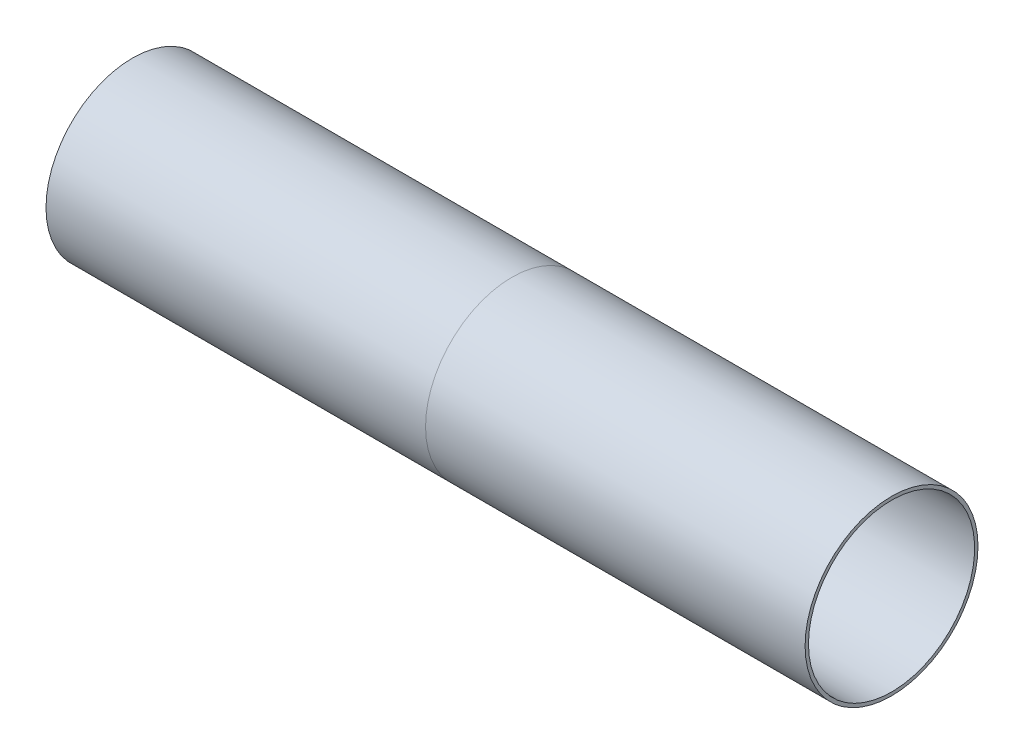
ISO-10303-21;
HEADER;
FILE_DESCRIPTION(('STEP AP214'),'2;1');
FILE_NAME('part.step','',(''),(''),'','','');
FILE_SCHEMA(('AUTOMOTIVE_DESIGN { 1 0 10303 214 1 1 1 1 }'));
ENDSEC;
DATA;
#1=APPLICATION_CONTEXT('core data for automotive mechanical design processes');
#2=APPLICATION_PROTOCOL_DEFINITION('international standard','automotive_design',2000,#1);
#3=PRODUCT_CONTEXT('',#1,'mechanical');
#4=PRODUCT('Part','Part','',(#3));
#5=PRODUCT_RELATED_PRODUCT_CATEGORY('part','',(#4));
#6=PRODUCT_DEFINITION_FORMATION('','',#4);
#7=PRODUCT_DEFINITION_CONTEXT('part definition',#1,'design');
#8=PRODUCT_DEFINITION('design','',#6,#7);
#9=PRODUCT_DEFINITION_SHAPE('','',#8);
#10=(LENGTH_UNIT() NAMED_UNIT(*) SI_UNIT(.MILLI.,.METRE.));
#11=(NAMED_UNIT(*) PLANE_ANGLE_UNIT() SI_UNIT($,.RADIAN.));
#12=(NAMED_UNIT(*) SI_UNIT($,.STERADIAN.) SOLID_ANGLE_UNIT());
#13=UNCERTAINTY_MEASURE_WITH_UNIT(LENGTH_MEASURE(1.E-05),#10,'distance_accuracy_value','');
#14=(GEOMETRIC_REPRESENTATION_CONTEXT(3) GLOBAL_UNCERTAINTY_ASSIGNED_CONTEXT((#13)) GLOBAL_UNIT_ASSIGNED_CONTEXT((#10,
#11,#12)) REPRESENTATION_CONTEXT('',''));
#15=CARTESIAN_POINT('',(0.,0.,0.));
#16=DIRECTION('',(0.,0.,1.));
#17=DIRECTION('',(1.,0.,0.));
#18=AXIS2_PLACEMENT_3D('',#15,#16,#17);
#19=CARTESIAN_POINT('',(-11.4300523027622,0.,-37.2));
#20=DIRECTION('',(1.,0.,0.));
#21=DIRECTION('',(0.,0.,-1.));
#22=AXIS2_PLACEMENT_3D('',#19,#20,#21);
#23=PLANE('',#22);
#24=CARTESIAN_POINT('',(-11.4300523027622,0.,0.));
#25=DIRECTION('',(-1.,0.,0.));
#26=DIRECTION('',(0.,0.,1.));
#27=AXIS2_PLACEMENT_3D('',#24,#25,#26);
#28=CIRCLE('',#27,37.2);
#29=CARTESIAN_POINT('',(-11.4300523027622,0.,37.2));
#30=VERTEX_POINT('',#29);
#31=EDGE_CURVE('E11',#30,#30,#28,.T.);
#32=ORIENTED_EDGE('',*,*,#31,.F.);
#33=EDGE_LOOP('',(#32));
#34=FACE_BOUND('',#33,.T.);
#35=CARTESIAN_POINT('',(-11.4300523027622,0.,0.));
#36=DIRECTION('',(-1.,0.,0.));
#37=DIRECTION('',(0.,0.,1.));
#38=AXIS2_PLACEMENT_3D('',#35,#36,#37);
#39=CIRCLE('',#38,38.4);
#40=CARTESIAN_POINT('',(-11.4300523027622,0.,38.4));
#41=VERTEX_POINT('',#40);
#42=EDGE_CURVE('E77',#41,#41,#39,.T.);
#43=ORIENTED_EDGE('',*,*,#42,.T.);
#44=EDGE_LOOP('',(#43));
#45=FACE_BOUND('',#44,.T.);
#46=ADVANCED_FACE('F58',(#34,#45),#23,.F.);
#47=CARTESIAN_POINT('',(0.,0.,0.));
#48=DIRECTION('',(-1.,0.,0.));
#49=DIRECTION('',(0.,0.,1.));
#50=AXIS2_PLACEMENT_3D('',#47,#48,#49);
#51=CYLINDRICAL_SURFACE('',#50,37.2);
#52=CARTESIAN_POINT('',(11.4300523027622,0.,0.));
#53=DIRECTION('',(-1.,0.,0.));
#54=DIRECTION('',(0.,0.,1.));
#55=AXIS2_PLACEMENT_3D('',#52,#53,#54);
#56=CIRCLE('',#55,37.2);
#57=CARTESIAN_POINT('',(11.4300523027622,0.,37.2));
#58=VERTEX_POINT('',#57);
#59=EDGE_CURVE('E64',#58,#58,#56,.T.);
#60=ORIENTED_EDGE('',*,*,#59,.F.);
#61=EDGE_LOOP('',(#60));
#62=FACE_BOUND('',#61,.T.);
#63=ORIENTED_EDGE('',*,*,#31,.T.);
#64=EDGE_LOOP('',(#63));
#65=FACE_BOUND('',#64,.T.);
#66=ADVANCED_FACE('F96',(#62,#65),#51,.F.);
#67=CARTESIAN_POINT('',(11.4300523027622,0.,-38.4));
#68=DIRECTION('',(-1.,0.,0.));
#69=DIRECTION('',(0.,0.,1.));
#70=AXIS2_PLACEMENT_3D('',#67,#68,#69);
#71=PLANE('',#70);
#72=CARTESIAN_POINT('',(11.4300523027622,0.,0.));
#73=DIRECTION('',(-1.,0.,0.));
#74=DIRECTION('',(0.,0.,1.));
#75=AXIS2_PLACEMENT_3D('',#72,#73,#74);
#76=CIRCLE('',#75,38.4);
#77=CARTESIAN_POINT('',(11.4300523027622,0.,38.4));
#78=VERTEX_POINT('',#77);
#79=EDGE_CURVE('E68',#78,#78,#76,.T.);
#80=ORIENTED_EDGE('',*,*,#79,.F.);
#81=EDGE_LOOP('',(#80));
#82=FACE_BOUND('',#81,.T.);
#83=ORIENTED_EDGE('',*,*,#59,.T.);
#84=EDGE_LOOP('',(#83));
#85=FACE_BOUND('',#84,.T.);
#86=ADVANCED_FACE('F91',(#82,#85),#71,.F.);
#87=CARTESIAN_POINT('',(11.4300523027622,0.,0.));
#88=DIRECTION('',(-1.,0.,0.));
#89=DIRECTION('',(0.,0.,1.));
#90=AXIS2_PLACEMENT_3D('',#87,#88,#89);
#91=CONICAL_SURFACE('',#90,38.4,0.0872664625997092);
#92=CARTESIAN_POINT('',(0.,0.,0.));
#93=DIRECTION('',(-1.,0.,0.));
#94=DIRECTION('',(0.,0.,1.));
#95=AXIS2_PLACEMENT_3D('',#92,#93,#94);
#96=CIRCLE('',#95,39.4);
#97=CARTESIAN_POINT('',(0.,0.,39.4));
#98=VERTEX_POINT('',#97);
#99=EDGE_CURVE('E72',#98,#98,#96,.T.);
#100=ORIENTED_EDGE('',*,*,#99,.F.);
#101=EDGE_LOOP('',(#100));
#102=FACE_BOUND('',#101,.T.);
#103=ORIENTED_EDGE('',*,*,#79,.T.);
#104=EDGE_LOOP('',(#103));
#105=FACE_BOUND('',#104,.T.);
#106=ADVANCED_FACE('F85',(#102,#105),#91,.T.);
#107=CARTESIAN_POINT('',(0.,0.,0.));
#108=DIRECTION('',(1.,0.,0.));
#109=DIRECTION('',(0.,0.,-1.));
#110=AXIS2_PLACEMENT_3D('',#107,#108,#109);
#111=CONICAL_SURFACE('',#110,39.4,0.0872664625997093);
#112=ORIENTED_EDGE('',*,*,#42,.F.);
#113=EDGE_LOOP('',(#112));
#114=FACE_BOUND('',#113,.T.);
#115=ORIENTED_EDGE('',*,*,#99,.T.);
#116=EDGE_LOOP('',(#115));
#117=FACE_BOUND('',#116,.T.);
#118=ADVANCED_FACE('F82',(#114,#117),#111,.T.);
#119=CLOSED_SHELL('',(#46,#66,#86,#106,#118));
#120=MANIFOLD_SOLID_BREP('B2_NOT_SHOWN',#119);
#121=CARTESIAN_POINT('',(0.,0.,0.));
#122=DIRECTION('',(-1.,0.,0.));
#123=DIRECTION('',(0.,0.,1.));
#124=AXIS2_PLACEMENT_3D('',#121,#122,#123);
#125=CYLINDRICAL_SURFACE('',#124,39.4);
#126=CARTESIAN_POINT('',(-12.4300523027622,0.,0.));
#127=DIRECTION('',(-1.,0.,0.));
#128=DIRECTION('',(0.,0.,1.));
#129=AXIS2_PLACEMENT_3D('',#126,#127,#128);
#130=CIRCLE('',#129,39.4);
#131=CARTESIAN_POINT('',(-12.4300523027622,0.,39.4));
#132=VERTEX_POINT('',#131);
#133=EDGE_CURVE('E179',#132,#132,#130,.T.);
#134=ORIENTED_EDGE('',*,*,#133,.F.);
#135=EDGE_LOOP('',(#134));
#136=FACE_BOUND('',#135,.T.);
#137=CARTESIAN_POINT('',(-167.569947697238,0.,0.));
#138=DIRECTION('',(1.,0.,0.));
#139=DIRECTION('',(0.,0.,-1.));
#140=AXIS2_PLACEMENT_3D('',#137,#138,#139);
#141=CIRCLE('',#140,39.4);
#142=CARTESIAN_POINT('',(-167.569947697238,0.,-39.4));
#143=VERTEX_POINT('',#142);
#144=EDGE_CURVE('E57',#143,#143,#141,.T.);
#145=ORIENTED_EDGE('',*,*,#144,.F.);
#146=EDGE_LOOP('',(#145));
#147=FACE_BOUND('',#146,.T.);
#148=ADVANCED_FACE('F162',(#136,#147),#125,.F.);
#149=CARTESIAN_POINT('',(0.,0.,0.));
#150=DIRECTION('',(-1.,0.,0.));
#151=DIRECTION('',(0.,0.,1.));
#152=AXIS2_PLACEMENT_3D('',#149,#150,#151);
#153=CYLINDRICAL_SURFACE('',#152,41.);
#154=CARTESIAN_POINT('',(0.,0.,0.));
#155=DIRECTION('',(-1.,0.,0.));
#156=DIRECTION('',(0.,0.,1.));
#157=AXIS2_PLACEMENT_3D('',#154,#155,#156);
#158=CIRCLE('',#157,41.);
#159=CARTESIAN_POINT('',(0.,0.,41.));
#160=VERTEX_POINT('',#159);
#161=EDGE_CURVE('E188',#160,#160,#158,.T.);
#162=ORIENTED_EDGE('',*,*,#161,.T.);
#163=EDGE_LOOP('',(#162));
#164=FACE_BOUND('',#163,.T.);
#165=CARTESIAN_POINT('',(-180.,0.,0.));
#166=DIRECTION('',(-1.,0.,0.));
#167=DIRECTION('',(0.,0.,1.));
#168=AXIS2_PLACEMENT_3D('',#165,#166,#167);
#169=CIRCLE('',#168,41.);
#170=CARTESIAN_POINT('',(-180.,0.,41.));
#171=VERTEX_POINT('',#170);
#172=EDGE_CURVE('E170',#171,#171,#169,.T.);
#173=ORIENTED_EDGE('',*,*,#172,.F.);
#174=EDGE_LOOP('',(#173));
#175=FACE_BOUND('',#174,.T.);
#176=ADVANCED_FACE('F205',(#164,#175),#153,.T.);
#177=CARTESIAN_POINT('',(-180.,0.,0.));
#178=DIRECTION('',(1.,0.,0.));
#179=DIRECTION('',(0.,0.,-1.));
#180=AXIS2_PLACEMENT_3D('',#177,#178,#179);
#181=PLANE('',#180);
#182=CARTESIAN_POINT('',(-180.,0.,0.));
#183=DIRECTION('',(-1.,0.,0.));
#184=DIRECTION('',(0.,0.,1.));
#185=AXIS2_PLACEMENT_3D('',#182,#183,#184);
#186=CIRCLE('',#185,39.4);
#187=CARTESIAN_POINT('',(-180.,0.,39.4));
#188=VERTEX_POINT('',#187);
#189=EDGE_CURVE('E174',#188,#188,#186,.T.);
#190=ORIENTED_EDGE('',*,*,#189,.F.);
#191=EDGE_LOOP('',(#190));
#192=FACE_BOUND('',#191,.T.);
#193=ORIENTED_EDGE('',*,*,#172,.T.);
#194=EDGE_LOOP('',(#193));
#195=FACE_BOUND('',#194,.T.);
#196=ADVANCED_FACE('F201',(#192,#195),#181,.F.);
#197=CARTESIAN_POINT('',(-11.4300523027622,0.,0.));
#198=DIRECTION('',(-1.,0.,0.));
#199=DIRECTION('',(0.,0.,1.));
#200=AXIS2_PLACEMENT_3D('',#197,#198,#199);
#201=CONICAL_SURFACE('',#200,38.4,0.785398163397444);
#202=ORIENTED_EDGE('',*,*,#133,.T.);
#203=EDGE_LOOP('',(#202));
#204=FACE_BOUND('',#203,.T.);
#205=CARTESIAN_POINT('',(-11.4300523027622,0.,0.));
#206=DIRECTION('',(-1.,0.,0.));
#207=DIRECTION('',(0.,0.,1.));
#208=AXIS2_PLACEMENT_3D('',#205,#206,#207);
#209=CIRCLE('',#208,38.4);
#210=CARTESIAN_POINT('',(-11.4300523027622,0.,38.4));
#211=VERTEX_POINT('',#210);
#212=EDGE_CURVE('E182',#211,#211,#209,.T.);
#213=ORIENTED_EDGE('',*,*,#212,.F.);
#214=EDGE_LOOP('',(#213));
#215=FACE_BOUND('',#214,.T.);
#216=ADVANCED_FACE('F204',(#204,#215),#201,.F.);
#217=CARTESIAN_POINT('',(0.,0.,0.));
#218=DIRECTION('',(1.,0.,0.));
#219=DIRECTION('',(0.,0.,-1.));
#220=AXIS2_PLACEMENT_3D('',#217,#218,#219);
#221=CONICAL_SURFACE('',#220,39.4,0.0872664625997093);
#222=ORIENTED_EDGE('',*,*,#212,.T.);
#223=EDGE_LOOP('',(#222));
#224=FACE_BOUND('',#223,.T.);
#225=CARTESIAN_POINT('',(0.,0.,0.));
#226=DIRECTION('',(-1.,0.,0.));
#227=DIRECTION('',(0.,0.,1.));
#228=AXIS2_PLACEMENT_3D('',#225,#226,#227);
#229=CIRCLE('',#228,39.4);
#230=CARTESIAN_POINT('',(0.,0.,39.4));
#231=VERTEX_POINT('',#230);
#232=EDGE_CURVE('E185',#231,#231,#229,.T.);
#233=ORIENTED_EDGE('',*,*,#232,.F.);
#234=EDGE_LOOP('',(#233));
#235=FACE_BOUND('',#234,.T.);
#236=ADVANCED_FACE('F221',(#224,#235),#221,.F.);
#237=CARTESIAN_POINT('',(0.,0.,0.));
#238=DIRECTION('',(1.,0.,0.));
#239=DIRECTION('',(0.,0.,-1.));
#240=AXIS2_PLACEMENT_3D('',#237,#238,#239);
#241=PLANE('',#240);
#242=ORIENTED_EDGE('',*,*,#232,.T.);
#243=EDGE_LOOP('',(#242));
#244=FACE_BOUND('',#243,.T.);
#245=ORIENTED_EDGE('',*,*,#161,.F.);
#246=EDGE_LOOP('',(#245));
#247=FACE_BOUND('',#246,.T.);
#248=ADVANCED_FACE('F217',(#244,#247),#241,.T.);
#249=CARTESIAN_POINT('',(-168.569947697238,0.,0.));
#250=DIRECTION('',(1.,0.,0.));
#251=DIRECTION('',(0.,0.,-1.));
#252=AXIS2_PLACEMENT_3D('',#249,#250,#251);
#253=CONICAL_SURFACE('',#252,38.4,0.785398163397431);
#254=ORIENTED_EDGE('',*,*,#144,.T.);
#255=EDGE_LOOP('',(#254));
#256=FACE_BOUND('',#255,.T.);
#257=CARTESIAN_POINT('',(-168.569947697238,0.,0.));
#258=DIRECTION('',(-1.,0.,0.));
#259=DIRECTION('',(0.,0.,1.));
#260=AXIS2_PLACEMENT_3D('',#257,#258,#259);
#261=CIRCLE('',#260,38.4);
#262=CARTESIAN_POINT('',(-168.569947697238,0.,38.4000000000001));
#263=VERTEX_POINT('',#262);
#264=EDGE_CURVE('E166',#263,#263,#261,.T.);
#265=ORIENTED_EDGE('',*,*,#264,.T.);
#266=EDGE_LOOP('',(#265));
#267=FACE_BOUND('',#266,.T.);
#268=ADVANCED_FACE('F164',(#256,#267),#253,.F.);
#269=CARTESIAN_POINT('',(-180.,0.,0.));
#270=DIRECTION('',(-1.,0.,0.));
#271=DIRECTION('',(0.,0.,1.));
#272=AXIS2_PLACEMENT_3D('',#269,#270,#271);
#273=CONICAL_SURFACE('',#272,39.4,0.0872664625997092);
#274=ORIENTED_EDGE('',*,*,#264,.F.);
#275=EDGE_LOOP('',(#274));
#276=FACE_BOUND('',#275,.T.);
#277=ORIENTED_EDGE('',*,*,#189,.T.);
#278=EDGE_LOOP('',(#277));
#279=FACE_BOUND('',#278,.T.);
#280=ADVANCED_FACE('F196',(#276,#279),#273,.F.);
#281=CLOSED_SHELL('',(#148,#176,#196,#216,#236,#248,#268,#280));
#282=MANIFOLD_SOLID_BREP('B6_NOT_SHOWN',#281);
#283=CARTESIAN_POINT('',(0.,0.,0.));
#284=DIRECTION('',(-1.,0.,0.));
#285=DIRECTION('',(0.,0.,1.));
#286=AXIS2_PLACEMENT_3D('',#283,#284,#285);
#287=CONICAL_SURFACE('',#286,39.4,0.0872664625997086);
#288=CARTESIAN_POINT('',(11.4300523027622,0.,0.));
#289=DIRECTION('',(-1.,0.,0.));
#290=DIRECTION('',(0.,0.,1.));
#291=AXIS2_PLACEMENT_3D('',#288,#289,#290);
#292=CIRCLE('',#291,38.4);
#293=CARTESIAN_POINT('',(11.4300523027622,0.,38.4));
#294=VERTEX_POINT('',#293);
#295=EDGE_CURVE('E161',#294,#294,#292,.T.);
#296=ORIENTED_EDGE('',*,*,#295,.F.);
#297=EDGE_LOOP('',(#296));
#298=FACE_BOUND('',#297,.T.);
#299=CARTESIAN_POINT('',(0.,0.,0.));
#300=DIRECTION('',(-1.,0.,0.));
#301=DIRECTION('',(0.,0.,1.));
#302=AXIS2_PLACEMENT_3D('',#299,#300,#301);
#303=CIRCLE('',#302,39.4);
#304=CARTESIAN_POINT('',(0.,0.,39.4));
#305=VERTEX_POINT('',#304);
#306=EDGE_CURVE('E349',#305,#305,#303,.T.);
#307=ORIENTED_EDGE('',*,*,#306,.T.);
#308=EDGE_LOOP('',(#307));
#309=FACE_BOUND('',#308,.T.);
#310=ADVANCED_FACE('F322',(#298,#309),#287,.F.);
#311=CARTESIAN_POINT('',(11.4300523027622,0.,0.));
#312=DIRECTION('',(1.,0.,0.));
#313=DIRECTION('',(0.,0.,-1.));
#314=AXIS2_PLACEMENT_3D('',#311,#312,#313);
#315=CONICAL_SURFACE('',#314,38.4,0.785398163397443);
#316=CARTESIAN_POINT('',(12.4300523027622,0.,0.));
#317=DIRECTION('',(-1.,0.,0.));
#318=DIRECTION('',(0.,0.,1.));
#319=AXIS2_PLACEMENT_3D('',#316,#317,#318);
#320=CIRCLE('',#319,39.4);
#321=CARTESIAN_POINT('',(12.4300523027622,0.,39.4));
#322=VERTEX_POINT('',#321);
#323=EDGE_CURVE('E329',#322,#322,#320,.T.);
#324=ORIENTED_EDGE('',*,*,#323,.F.);
#325=EDGE_LOOP('',(#324));
#326=FACE_BOUND('',#325,.T.);
#327=ORIENTED_EDGE('',*,*,#295,.T.);
#328=EDGE_LOOP('',(#327));
#329=FACE_BOUND('',#328,.T.);
#330=ADVANCED_FACE('F375',(#326,#329),#315,.F.);
#331=CARTESIAN_POINT('',(0.,0.,0.));
#332=DIRECTION('',(-1.,0.,0.));
#333=DIRECTION('',(0.,0.,1.));
#334=AXIS2_PLACEMENT_3D('',#331,#332,#333);
#335=CYLINDRICAL_SURFACE('',#334,39.4);
#336=ORIENTED_EDGE('',*,*,#323,.T.);
#337=EDGE_LOOP('',(#336));
#338=FACE_BOUND('',#337,.T.);
#339=CARTESIAN_POINT('',(180.,0.,0.));
#340=DIRECTION('',(-1.,0.,0.));
#341=DIRECTION('',(0.,0.,1.));
#342=AXIS2_PLACEMENT_3D('',#339,#340,#341);
#343=CIRCLE('',#342,39.4000000000001);
#344=CARTESIAN_POINT('',(180.,0.,39.4000000000001));
#345=VERTEX_POINT('',#344);
#346=EDGE_CURVE('E334',#345,#345,#343,.T.);
#347=ORIENTED_EDGE('',*,*,#346,.F.);
#348=EDGE_LOOP('',(#347));
#349=FACE_BOUND('',#348,.T.);
#350=ADVANCED_FACE('F369',(#338,#349),#335,.F.);
#351=CARTESIAN_POINT('',(180.,0.,0.));
#352=DIRECTION('',(1.,0.,0.));
#353=DIRECTION('',(0.,0.,-1.));
#354=AXIS2_PLACEMENT_3D('',#351,#352,#353);
#355=PLANE('',#354);
#356=ORIENTED_EDGE('',*,*,#346,.T.);
#357=EDGE_LOOP('',(#356));
#358=FACE_BOUND('',#357,.T.);
#359=CARTESIAN_POINT('',(180.,0.,0.));
#360=DIRECTION('',(-1.,0.,0.));
#361=DIRECTION('',(0.,0.,1.));
#362=AXIS2_PLACEMENT_3D('',#359,#360,#361);
#363=CIRCLE('',#362,41.);
#364=CARTESIAN_POINT('',(180.,0.,41.));
#365=VERTEX_POINT('',#364);
#366=EDGE_CURVE('E339',#365,#365,#363,.T.);
#367=ORIENTED_EDGE('',*,*,#366,.F.);
#368=EDGE_LOOP('',(#367));
#369=FACE_BOUND('',#368,.T.);
#370=ADVANCED_FACE('F364',(#358,#369),#355,.T.);
#371=CARTESIAN_POINT('',(0.,0.,0.));
#372=DIRECTION('',(-1.,0.,0.));
#373=DIRECTION('',(0.,0.,1.));
#374=AXIS2_PLACEMENT_3D('',#371,#372,#373);
#375=CYLINDRICAL_SURFACE('',#374,41.);
#376=CARTESIAN_POINT('',(0.,0.,0.));
#377=DIRECTION('',(-1.,0.,0.));
#378=DIRECTION('',(0.,0.,1.));
#379=AXIS2_PLACEMENT_3D('',#376,#377,#378);
#380=CIRCLE('',#379,41.);
#381=CARTESIAN_POINT('',(0.,0.,41.));
#382=VERTEX_POINT('',#381);
#383=EDGE_CURVE('E345',#382,#382,#380,.T.);
#384=ORIENTED_EDGE('',*,*,#383,.F.);
#385=EDGE_LOOP('',(#384));
#386=FACE_BOUND('',#385,.T.);
#387=ORIENTED_EDGE('',*,*,#366,.T.);
#388=EDGE_LOOP('',(#387));
#389=FACE_BOUND('',#388,.T.);
#390=ADVANCED_FACE('F358',(#386,#389),#375,.T.);
#391=CARTESIAN_POINT('',(0.,0.,0.));
#392=DIRECTION('',(1.,0.,0.));
#393=DIRECTION('',(0.,0.,-1.));
#394=AXIS2_PLACEMENT_3D('',#391,#392,#393);
#395=PLANE('',#394);
#396=ORIENTED_EDGE('',*,*,#306,.F.);
#397=EDGE_LOOP('',(#396));
#398=FACE_BOUND('',#397,.T.);
#399=ORIENTED_EDGE('',*,*,#383,.T.);
#400=EDGE_LOOP('',(#399));
#401=FACE_BOUND('',#400,.T.);
#402=ADVANCED_FACE('F355',(#398,#401),#395,.F.);
#403=CLOSED_SHELL('',(#310,#330,#350,#370,#390,#402));
#404=MANIFOLD_SOLID_BREP('B52',#403);
#405=ADVANCED_BREP_SHAPE_REPRESENTATION('',(#18,#120,#282,#404),#14);
#406=SHAPE_DEFINITION_REPRESENTATION(#9,#405);
ENDSEC;
END-ISO-10303-21;
